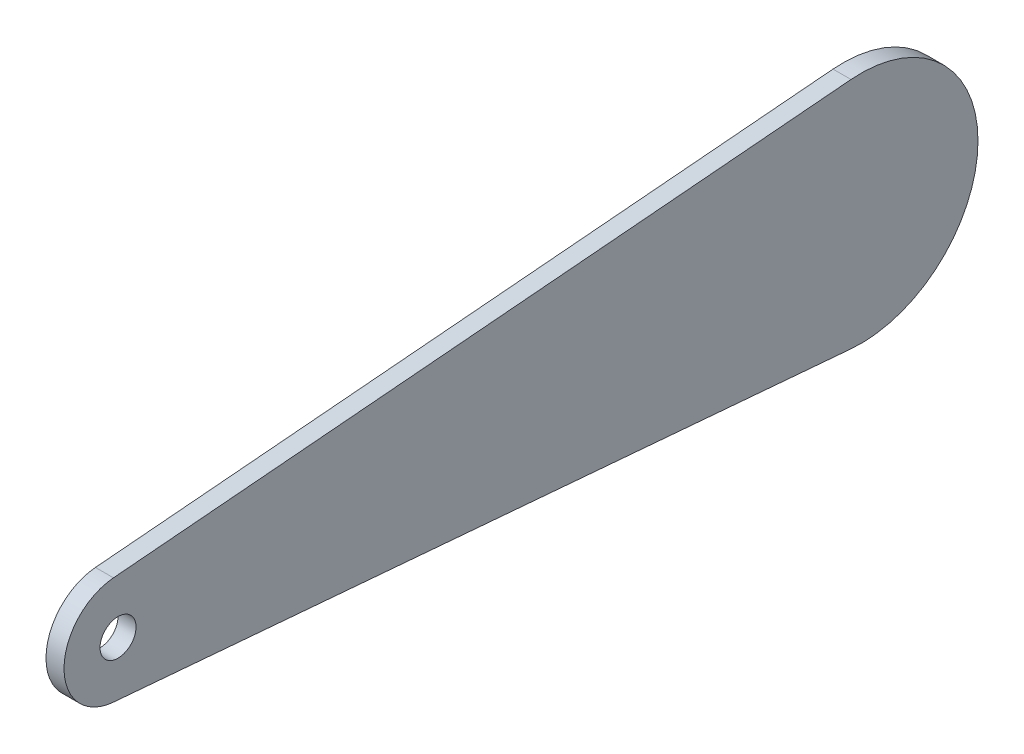
ISO-10303-21;
HEADER;
FILE_DESCRIPTION(('STEP AP214'),'2;1');
FILE_NAME('part.step','',(''),(''),'','','');
FILE_SCHEMA(('AUTOMOTIVE_DESIGN { 1 0 10303 214 1 1 1 1 }'));
ENDSEC;
DATA;
#1=APPLICATION_CONTEXT('core data for automotive mechanical design processes');
#2=APPLICATION_PROTOCOL_DEFINITION('international standard','automotive_design',2000,#1);
#3=PRODUCT_CONTEXT('',#1,'mechanical');
#4=PRODUCT('Part','Part','',(#3));
#5=PRODUCT_RELATED_PRODUCT_CATEGORY('part','',(#4));
#6=PRODUCT_DEFINITION_FORMATION('','',#4);
#7=PRODUCT_DEFINITION_CONTEXT('part definition',#1,'design');
#8=PRODUCT_DEFINITION('design','',#6,#7);
#9=PRODUCT_DEFINITION_SHAPE('','',#8);
#10=(LENGTH_UNIT() NAMED_UNIT(*) SI_UNIT(.MILLI.,.METRE.));
#11=(NAMED_UNIT(*) PLANE_ANGLE_UNIT() SI_UNIT($,.RADIAN.));
#12=(NAMED_UNIT(*) SI_UNIT($,.STERADIAN.) SOLID_ANGLE_UNIT());
#13=UNCERTAINTY_MEASURE_WITH_UNIT(LENGTH_MEASURE(1.E-05),#10,'distance_accuracy_value','');
#14=(GEOMETRIC_REPRESENTATION_CONTEXT(3) GLOBAL_UNCERTAINTY_ASSIGNED_CONTEXT((#13)) GLOBAL_UNIT_ASSIGNED_CONTEXT((#10,
#11,#12)) REPRESENTATION_CONTEXT('',''));
#15=CARTESIAN_POINT('',(0.,0.,0.));
#16=DIRECTION('',(0.,0.,1.));
#17=DIRECTION('',(1.,0.,0.));
#18=AXIS2_PLACEMENT_3D('',#15,#16,#17);
#19=CARTESIAN_POINT('',(10.,0.,206.2396185));
#20=DIRECTION('',(1.,0.,0.));
#21=DIRECTION('',(0.,0.,-1.));
#22=AXIS2_PLACEMENT_3D('',#19,#20,#21);
#23=PLANE('',#22);
#24=CARTESIAN_POINT('',(10.,0.,206.2396185));
#25=DIRECTION('',(1.,0.,0.));
#26=DIRECTION('',(0.,0.,-1.));
#27=AXIS2_PLACEMENT_3D('',#24,#25,#26);
#28=CIRCLE('',#27,30.);
#29=CARTESIAN_POINT('',(10.,29.8918050448383,208.785201176201));
#30=VERTEX_POINT('',#29);
#31=CARTESIAN_POINT('',(10.,-29.8918050448383,208.785201176201));
#32=VERTEX_POINT('',#31);
#33=EDGE_CURVE('E96',#30,#32,#28,.T.);
#34=ORIENTED_EDGE('',*,*,#33,.T.);
#35=DIRECTION('',(0.,-0.0848527558733823,-0.996393501494611));
#36=VECTOR('',#35,1.);
#37=CARTESIAN_POINT('',(10.,-29.8918050448383,208.785201176201));
#38=LINE('',#37,#36);
#39=CARTESIAN_POINT('',(10.,-64.7655775971497,-200.72418936823));
#40=VERTEX_POINT('',#39);
#41=EDGE_CURVE('E91',#32,#40,#38,.T.);
#42=ORIENTED_EDGE('',*,*,#41,.T.);
#43=CARTESIAN_POINT('',(10.,0.,-206.2396185));
#44=DIRECTION('',(1.,0.,0.));
#45=DIRECTION('',(0.,0.,-1.));
#46=AXIS2_PLACEMENT_3D('',#43,#44,#45);
#47=CIRCLE('',#46,65.);
#48=CARTESIAN_POINT('',(10.,64.7655775971497,-200.72418936823));
#49=VERTEX_POINT('',#48);
#50=EDGE_CURVE('E94',#40,#49,#47,.T.);
#51=ORIENTED_EDGE('',*,*,#50,.T.);
#52=DIRECTION('',(0.,-0.0848527558733823,0.996393501494611));
#53=VECTOR('',#52,1.);
#54=CARTESIAN_POINT('',(10.,29.8918050448383,208.785201176201));
#55=LINE('',#54,#53);
#56=EDGE_CURVE('E61',#49,#30,#55,.T.);
#57=ORIENTED_EDGE('',*,*,#56,.T.);
#58=EDGE_LOOP('',(#34,#42,#51,#57));
#59=FACE_BOUND('',#58,.T.);
#60=CARTESIAN_POINT('',(10.,0.,206.2396185));
#61=DIRECTION('',(1.,0.,0.));
#62=DIRECTION('',(0.,0.,-1.));
#63=AXIS2_PLACEMENT_3D('',#60,#61,#62);
#64=CIRCLE('',#63,10.);
#65=CARTESIAN_POINT('',(10.,0.,196.2396185));
#66=VERTEX_POINT('',#65);
#67=EDGE_CURVE('E116',#66,#66,#64,.T.);
#68=ORIENTED_EDGE('',*,*,#67,.F.);
#69=EDGE_LOOP('',(#68));
#70=FACE_BOUND('',#69,.T.);
#71=ADVANCED_FACE('F43',(#59,#70),#23,.T.);
#72=CARTESIAN_POINT('',(0.,0.,206.2396185));
#73=DIRECTION('',(1.,0.,0.));
#74=DIRECTION('',(0.,0.,-1.));
#75=AXIS2_PLACEMENT_3D('',#72,#73,#74);
#76=PLANE('',#75);
#77=CARTESIAN_POINT('',(0.,0.,206.2396185));
#78=DIRECTION('',(1.,0.,0.));
#79=DIRECTION('',(0.,0.,-1.));
#80=AXIS2_PLACEMENT_3D('',#77,#78,#79);
#81=CIRCLE('',#80,30.);
#82=CARTESIAN_POINT('',(0.,29.8918050448383,208.785201176201));
#83=VERTEX_POINT('',#82);
#84=CARTESIAN_POINT('',(0.,-29.8918050448383,208.785201176201));
#85=VERTEX_POINT('',#84);
#86=EDGE_CURVE('E112',#83,#85,#81,.T.);
#87=ORIENTED_EDGE('',*,*,#86,.F.);
#88=DIRECTION('',(0.,-0.0848527558733823,0.996393501494611));
#89=VECTOR('',#88,1.);
#90=CARTESIAN_POINT('',(0.,29.8918050448383,208.785201176201));
#91=LINE('',#90,#89);
#92=CARTESIAN_POINT('',(0.,64.7655775971497,-200.72418936823));
#93=VERTEX_POINT('',#92);
#94=EDGE_CURVE('E84',#93,#83,#91,.T.);
#95=ORIENTED_EDGE('',*,*,#94,.F.);
#96=CARTESIAN_POINT('',(0.,0.,-206.2396185));
#97=DIRECTION('',(1.,0.,0.));
#98=DIRECTION('',(0.,0.,-1.));
#99=AXIS2_PLACEMENT_3D('',#96,#97,#98);
#100=CIRCLE('',#99,65.);
#101=CARTESIAN_POINT('',(0.,-64.7655775971497,-200.72418936823));
#102=VERTEX_POINT('',#101);
#103=EDGE_CURVE('E78',#102,#93,#100,.T.);
#104=ORIENTED_EDGE('',*,*,#103,.F.);
#105=DIRECTION('',(0.,-0.0848527558733823,-0.996393501494611));
#106=VECTOR('',#105,1.);
#107=CARTESIAN_POINT('',(0.,-29.8918050448383,208.785201176201));
#108=LINE('',#107,#106);
#109=EDGE_CURVE('E101',#85,#102,#108,.T.);
#110=ORIENTED_EDGE('',*,*,#109,.F.);
#111=EDGE_LOOP('',(#87,#95,#104,#110));
#112=FACE_BOUND('',#111,.T.);
#113=CARTESIAN_POINT('',(0.,0.,206.2396185));
#114=DIRECTION('',(1.,0.,0.));
#115=DIRECTION('',(0.,0.,-1.));
#116=AXIS2_PLACEMENT_3D('',#113,#114,#115);
#117=CIRCLE('',#116,10.);
#118=CARTESIAN_POINT('',(0.,0.,196.2396185));
#119=VERTEX_POINT('',#118);
#120=EDGE_CURVE('E134',#119,#119,#117,.T.);
#121=ORIENTED_EDGE('',*,*,#120,.T.);
#122=EDGE_LOOP('',(#121));
#123=FACE_BOUND('',#122,.T.);
#124=ADVANCED_FACE('F129',(#112,#123),#76,.F.);
#125=CARTESIAN_POINT('',(10.,0.,206.2396185));
#126=DIRECTION('',(-1.,0.,0.));
#127=DIRECTION('',(0.,0.,1.));
#128=AXIS2_PLACEMENT_3D('',#125,#126,#127);
#129=CYLINDRICAL_SURFACE('',#128,30.);
#130=ORIENTED_EDGE('',*,*,#86,.T.);
#131=DIRECTION('',(-1.,0.,0.));
#132=VECTOR('',#131,1.);
#133=CARTESIAN_POINT('',(10.,-29.8918050448383,208.785201176201));
#134=LINE('',#133,#132);
#135=EDGE_CURVE('E11',#32,#85,#134,.T.);
#136=ORIENTED_EDGE('',*,*,#135,.F.);
#137=ORIENTED_EDGE('',*,*,#33,.F.);
#138=DIRECTION('',(-1.,0.,0.));
#139=VECTOR('',#138,1.);
#140=CARTESIAN_POINT('',(10.,29.8918050448383,208.785201176201));
#141=LINE('',#140,#139);
#142=EDGE_CURVE('E108',#30,#83,#141,.T.);
#143=ORIENTED_EDGE('',*,*,#142,.T.);
#144=EDGE_LOOP('',(#130,#136,#137,#143));
#145=FACE_BOUND('',#144,.T.);
#146=ADVANCED_FACE('F45',(#145),#129,.T.);
#147=CARTESIAN_POINT('',(10.,-29.8918050448383,208.785201176201));
#148=DIRECTION('',(0.,0.996393501494611,-0.0848527558733823));
#149=DIRECTION('',(0.,0.0848527558733824,0.996393501494612));
#150=AXIS2_PLACEMENT_3D('',#147,#148,#149);
#151=PLANE('',#150);
#152=ORIENTED_EDGE('',*,*,#109,.T.);
#153=DIRECTION('',(-1.,0.,0.));
#154=VECTOR('',#153,1.);
#155=CARTESIAN_POINT('',(10.,-64.7655775971497,-200.72418936823));
#156=LINE('',#155,#154);
#157=EDGE_CURVE('E53',#40,#102,#156,.T.);
#158=ORIENTED_EDGE('',*,*,#157,.F.);
#159=ORIENTED_EDGE('',*,*,#41,.F.);
#160=ORIENTED_EDGE('',*,*,#135,.T.);
#161=EDGE_LOOP('',(#152,#158,#159,#160));
#162=FACE_BOUND('',#161,.T.);
#163=ADVANCED_FACE('F100',(#162),#151,.F.);
#164=CARTESIAN_POINT('',(10.,0.,-206.2396185));
#165=DIRECTION('',(-1.,0.,0.));
#166=DIRECTION('',(0.,0.,1.));
#167=AXIS2_PLACEMENT_3D('',#164,#165,#166);
#168=CYLINDRICAL_SURFACE('',#167,65.);
#169=ORIENTED_EDGE('',*,*,#103,.T.);
#170=DIRECTION('',(-1.,0.,0.));
#171=VECTOR('',#170,1.);
#172=CARTESIAN_POINT('',(10.,64.7655775971497,-200.72418936823));
#173=LINE('',#172,#171);
#174=EDGE_CURVE('E103',#49,#93,#173,.T.);
#175=ORIENTED_EDGE('',*,*,#174,.F.);
#176=ORIENTED_EDGE('',*,*,#50,.F.);
#177=ORIENTED_EDGE('',*,*,#157,.T.);
#178=EDGE_LOOP('',(#169,#175,#176,#177));
#179=FACE_BOUND('',#178,.T.);
#180=ADVANCED_FACE('F104',(#179),#168,.T.);
#181=CARTESIAN_POINT('',(10.,29.8918050448383,208.785201176201));
#182=DIRECTION('',(0.,-0.996393501494611,-0.0848527558733823));
#183=DIRECTION('',(0.,0.0848527558733823,-0.996393501494612));
#184=AXIS2_PLACEMENT_3D('',#181,#182,#183);
#185=PLANE('',#184);
#186=ORIENTED_EDGE('',*,*,#94,.T.);
#187=ORIENTED_EDGE('',*,*,#142,.F.);
#188=ORIENTED_EDGE('',*,*,#56,.F.);
#189=ORIENTED_EDGE('',*,*,#174,.T.);
#190=EDGE_LOOP('',(#186,#187,#188,#189));
#191=FACE_BOUND('',#190,.T.);
#192=ADVANCED_FACE('F126',(#191),#185,.F.);
#193=CARTESIAN_POINT('',(10.,0.,206.2396185));
#194=DIRECTION('',(-1.,0.,0.));
#195=DIRECTION('',(0.,0.,1.));
#196=AXIS2_PLACEMENT_3D('',#193,#194,#195);
#197=CYLINDRICAL_SURFACE('',#196,10.);
#198=ORIENTED_EDGE('',*,*,#67,.T.);
#199=EDGE_LOOP('',(#198));
#200=FACE_BOUND('',#199,.T.);
#201=ORIENTED_EDGE('',*,*,#120,.F.);
#202=EDGE_LOOP('',(#201));
#203=FACE_BOUND('',#202,.T.);
#204=ADVANCED_FACE('F142',(#200,#203),#197,.F.);
#205=CLOSED_SHELL('',(#71,#124,#146,#163,#180,#192,#204));
#206=MANIFOLD_SOLID_BREP('B2',#205);
#207=ADVANCED_BREP_SHAPE_REPRESENTATION('',(#18,#206),#14);
#208=SHAPE_DEFINITION_REPRESENTATION(#9,#207);
ENDSEC;
END-ISO-10303-21;
